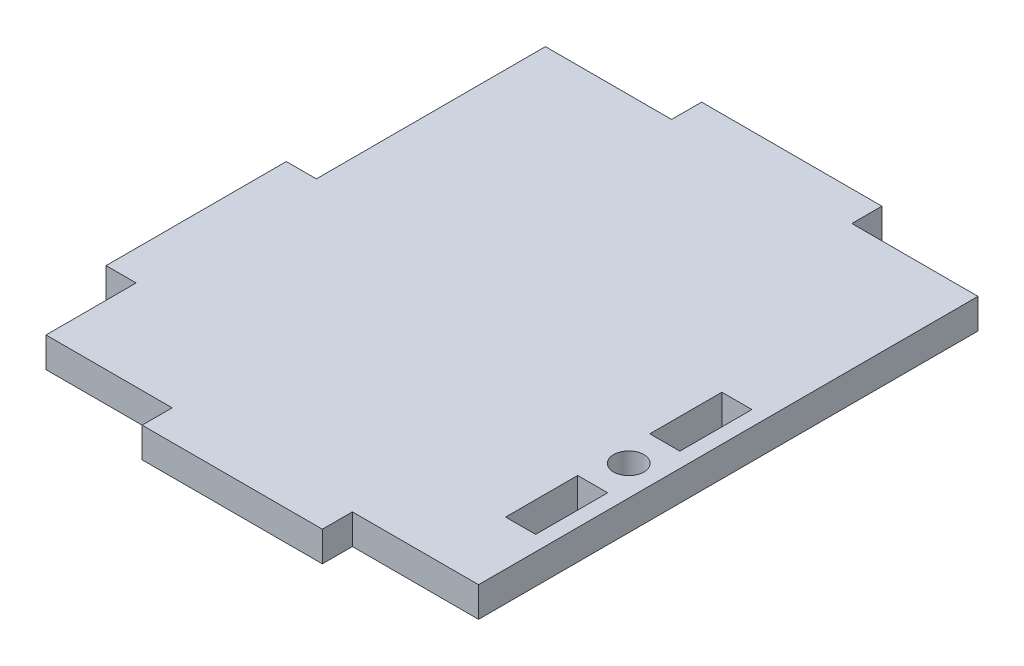
ISO-10303-21;
HEADER;
FILE_DESCRIPTION(('STEP AP214'),'2;1');
FILE_NAME('part.step','',(''),(''),'','','');
FILE_SCHEMA(('AUTOMOTIVE_DESIGN { 1 0 10303 214 1 1 1 1 }'));
ENDSEC;
DATA;
#1=APPLICATION_CONTEXT('core data for automotive mechanical design processes');
#2=APPLICATION_PROTOCOL_DEFINITION('international standard','automotive_design',2000,#1);
#3=PRODUCT_CONTEXT('',#1,'mechanical');
#4=PRODUCT('Part','Part','',(#3));
#5=PRODUCT_RELATED_PRODUCT_CATEGORY('part','',(#4));
#6=PRODUCT_DEFINITION_FORMATION('','',#4);
#7=PRODUCT_DEFINITION_CONTEXT('part definition',#1,'design');
#8=PRODUCT_DEFINITION('design','',#6,#7);
#9=PRODUCT_DEFINITION_SHAPE('','',#8);
#10=(LENGTH_UNIT() NAMED_UNIT(*) SI_UNIT(.MILLI.,.METRE.));
#11=(NAMED_UNIT(*) PLANE_ANGLE_UNIT() SI_UNIT($,.RADIAN.));
#12=(NAMED_UNIT(*) SI_UNIT($,.STERADIAN.) SOLID_ANGLE_UNIT());
#13=UNCERTAINTY_MEASURE_WITH_UNIT(LENGTH_MEASURE(1.E-05),#10,'distance_accuracy_value','');
#14=(GEOMETRIC_REPRESENTATION_CONTEXT(3) GLOBAL_UNCERTAINTY_ASSIGNED_CONTEXT((#13)) GLOBAL_UNIT_ASSIGNED_CONTEXT((#10,
#11,#12)) REPRESENTATION_CONTEXT('',''));
#15=CARTESIAN_POINT('',(0.,0.,0.));
#16=DIRECTION('',(0.,0.,1.));
#17=DIRECTION('',(1.,0.,0.));
#18=AXIS2_PLACEMENT_3D('',#15,#16,#17);
#19=CARTESIAN_POINT('',(0.,3.175,0.));
#20=DIRECTION('',(0.,1.,0.));
#21=DIRECTION('',(0.,0.,1.));
#22=AXIS2_PLACEMENT_3D('',#19,#20,#21);
#23=PLANE('',#22);
#24=CARTESIAN_POINT('',(42.545,3.175,-19.05));
#25=DIRECTION('',(0.,1.,0.));
#26=DIRECTION('',(0.,0.,1.));
#27=AXIS2_PLACEMENT_3D('',#24,#25,#26);
#28=CIRCLE('',#27,1.6);
#29=CARTESIAN_POINT('',(42.545,3.175,-17.45));
#30=VERTEX_POINT('',#29);
#31=EDGE_CURVE('E686',#30,#30,#28,.T.);
#32=ORIENTED_EDGE('',*,*,#31,.F.);
#33=EDGE_LOOP('',(#32));
#34=FACE_BOUND('',#33,.T.);
#35=DIRECTION('',(0.,0.,1.));
#36=VECTOR('',#35,1.);
#37=CARTESIAN_POINT('',(0.,3.175,-9.525));
#38=LINE('',#37,#36);
#39=CARTESIAN_POINT('',(0.,3.175,-9.525));
#40=VERTEX_POINT('',#39);
#41=CARTESIAN_POINT('',(0.,3.175,0.));
#42=VERTEX_POINT('',#41);
#43=EDGE_CURVE('E263',#40,#42,#38,.T.);
#44=ORIENTED_EDGE('',*,*,#43,.T.);
#45=DIRECTION('',(1.,0.,0.));
#46=VECTOR('',#45,1.);
#47=CARTESIAN_POINT('',(0.,3.175,0.));
#48=LINE('',#47,#46);
#49=CARTESIAN_POINT('',(13.335,3.175,0.));
#50=VERTEX_POINT('',#49);
#51=EDGE_CURVE('E266',#42,#50,#48,.T.);
#52=ORIENTED_EDGE('',*,*,#51,.T.);
#53=DIRECTION('',(0.,0.,1.));
#54=VECTOR('',#53,1.);
#55=CARTESIAN_POINT('',(13.335,3.175,0.));
#56=LINE('',#55,#54);
#57=CARTESIAN_POINT('',(13.335,3.175,3.175));
#58=VERTEX_POINT('',#57);
#59=EDGE_CURVE('E269',#50,#58,#56,.T.);
#60=ORIENTED_EDGE('',*,*,#59,.T.);
#61=DIRECTION('',(1.,0.,0.));
#62=VECTOR('',#61,1.);
#63=CARTESIAN_POINT('',(13.335,3.175,3.175));
#64=LINE('',#63,#62);
#65=CARTESIAN_POINT('',(32.385,3.175,3.175));
#66=VERTEX_POINT('',#65);
#67=EDGE_CURVE('E271',#58,#66,#64,.T.);
#68=ORIENTED_EDGE('',*,*,#67,.T.);
#69=DIRECTION('',(0.,0.,-1.));
#70=VECTOR('',#69,1.);
#71=CARTESIAN_POINT('',(32.385,3.175,3.175));
#72=LINE('',#71,#70);
#73=CARTESIAN_POINT('',(32.385,3.175,0.));
#74=VERTEX_POINT('',#73);
#75=EDGE_CURVE('E273',#66,#74,#72,.T.);
#76=ORIENTED_EDGE('',*,*,#75,.T.);
#77=DIRECTION('',(1.,0.,0.));
#78=VECTOR('',#77,1.);
#79=CARTESIAN_POINT('',(32.385,3.175,0.));
#80=LINE('',#79,#78);
#81=CARTESIAN_POINT('',(45.72,3.175,0.));
#82=VERTEX_POINT('',#81);
#83=EDGE_CURVE('E275',#74,#82,#80,.T.);
#84=ORIENTED_EDGE('',*,*,#83,.T.);
#85=DIRECTION('',(0.,0.,-1.));
#86=VECTOR('',#85,1.);
#87=CARTESIAN_POINT('',(45.72,3.175,0.));
#88=LINE('',#87,#86);
#89=CARTESIAN_POINT('',(45.72,3.175,-52.78882));
#90=VERTEX_POINT('',#89);
#91=EDGE_CURVE('E277',#82,#90,#88,.T.);
#92=ORIENTED_EDGE('',*,*,#91,.T.);
#93=DIRECTION('',(-1.,0.,0.));
#94=VECTOR('',#93,1.);
#95=CARTESIAN_POINT('',(45.72,3.175,-52.78882));
#96=LINE('',#95,#94);
#97=CARTESIAN_POINT('',(32.385,3.175,-52.78882));
#98=VERTEX_POINT('',#97);
#99=EDGE_CURVE('E279',#90,#98,#96,.T.);
#100=ORIENTED_EDGE('',*,*,#99,.T.);
#101=DIRECTION('',(0.,0.,-1.));
#102=VECTOR('',#101,1.);
#103=CARTESIAN_POINT('',(32.385,3.175,-52.78882));
#104=LINE('',#103,#102);
#105=CARTESIAN_POINT('',(32.385,3.175,-55.96382));
#106=VERTEX_POINT('',#105);
#107=EDGE_CURVE('E281',#98,#106,#104,.T.);
#108=ORIENTED_EDGE('',*,*,#107,.T.);
#109=DIRECTION('',(-1.,0.,0.));
#110=VECTOR('',#109,1.);
#111=CARTESIAN_POINT('',(32.385,3.175,-55.96382));
#112=LINE('',#111,#110);
#113=CARTESIAN_POINT('',(13.335,3.175,-55.96382));
#114=VERTEX_POINT('',#113);
#115=EDGE_CURVE('E283',#106,#114,#112,.T.);
#116=ORIENTED_EDGE('',*,*,#115,.T.);
#117=DIRECTION('',(0.,0.,1.));
#118=VECTOR('',#117,1.);
#119=CARTESIAN_POINT('',(13.335,3.175,-55.96382));
#120=LINE('',#119,#118);
#121=CARTESIAN_POINT('',(13.335,3.175,-52.78882));
#122=VERTEX_POINT('',#121);
#123=EDGE_CURVE('E285',#114,#122,#120,.T.);
#124=ORIENTED_EDGE('',*,*,#123,.T.);
#125=DIRECTION('',(-1.,0.,0.));
#126=VECTOR('',#125,1.);
#127=CARTESIAN_POINT('',(13.335,3.175,-52.78882));
#128=LINE('',#127,#126);
#129=CARTESIAN_POINT('',(0.,3.175,-52.78882));
#130=VERTEX_POINT('',#129);
#131=EDGE_CURVE('E287',#122,#130,#128,.T.);
#132=ORIENTED_EDGE('',*,*,#131,.T.);
#133=DIRECTION('',(0.,0.,1.));
#134=VECTOR('',#133,1.);
#135=CARTESIAN_POINT('',(0.,3.175,-52.78882));
#136=LINE('',#135,#134);
#137=CARTESIAN_POINT('',(0.,3.175,-28.575));
#138=VERTEX_POINT('',#137);
#139=EDGE_CURVE('E289',#130,#138,#136,.T.);
#140=ORIENTED_EDGE('',*,*,#139,.T.);
#141=DIRECTION('',(-1.,0.,0.));
#142=VECTOR('',#141,1.);
#143=CARTESIAN_POINT('',(0.,3.175,-28.575));
#144=LINE('',#143,#142);
#145=CARTESIAN_POINT('',(-3.175,3.175,-28.575));
#146=VERTEX_POINT('',#145);
#147=EDGE_CURVE('E291',#138,#146,#144,.T.);
#148=ORIENTED_EDGE('',*,*,#147,.T.);
#149=DIRECTION('',(0.,0.,1.));
#150=VECTOR('',#149,1.);
#151=CARTESIAN_POINT('',(-3.175,3.175,-28.575));
#152=LINE('',#151,#150);
#153=CARTESIAN_POINT('',(-3.17499999999999,3.175,-9.525));
#154=VERTEX_POINT('',#153);
#155=EDGE_CURVE('E293',#146,#154,#152,.T.);
#156=ORIENTED_EDGE('',*,*,#155,.T.);
#157=DIRECTION('',(1.,0.,0.));
#158=VECTOR('',#157,1.);
#159=CARTESIAN_POINT('',(-3.17499999999999,3.175,-9.525));
#160=LINE('',#159,#158);
#161=EDGE_CURVE('E295',#154,#40,#160,.T.);
#162=ORIENTED_EDGE('',*,*,#161,.T.);
#163=EDGE_LOOP('',(#44,#52,#60,#68,#76,#84,#92,#100,#108,#116,#124,#132,#140,#148,#156,#162));
#164=FACE_BOUND('',#163,.T.);
#165=DIRECTION('',(1.,0.,0.));
#166=VECTOR('',#165,1.);
#167=CARTESIAN_POINT('',(40.9575,3.175,-22.86));
#168=LINE('',#167,#166);
#169=CARTESIAN_POINT('',(40.9575,3.175,-22.86));
#170=VERTEX_POINT('',#169);
#171=CARTESIAN_POINT('',(44.1325,3.175,-22.86));
#172=VERTEX_POINT('',#171);
#173=EDGE_CURVE('E234',#170,#172,#168,.T.);
#174=ORIENTED_EDGE('',*,*,#173,.F.);
#175=DIRECTION('',(0.,0.,1.));
#176=VECTOR('',#175,1.);
#177=CARTESIAN_POINT('',(40.9575,3.175,-30.48));
#178=LINE('',#177,#176);
#179=CARTESIAN_POINT('',(40.9575,3.175,-30.48));
#180=VERTEX_POINT('',#179);
#181=EDGE_CURVE('E232',#180,#170,#178,.T.);
#182=ORIENTED_EDGE('',*,*,#181,.F.);
#183=DIRECTION('',(-1.,0.,0.));
#184=VECTOR('',#183,1.);
#185=CARTESIAN_POINT('',(40.9575,3.175,-30.48));
#186=LINE('',#185,#184);
#187=CARTESIAN_POINT('',(44.1325,3.175,-30.48));
#188=VERTEX_POINT('',#187);
#189=EDGE_CURVE('E240',#188,#180,#186,.T.);
#190=ORIENTED_EDGE('',*,*,#189,.F.);
#191=DIRECTION('',(0.,0.,-1.));
#192=VECTOR('',#191,1.);
#193=CARTESIAN_POINT('',(44.1325,3.175,-30.48));
#194=LINE('',#193,#192);
#195=EDGE_CURVE('E237',#172,#188,#194,.T.);
#196=ORIENTED_EDGE('',*,*,#195,.F.);
#197=EDGE_LOOP('',(#174,#182,#190,#196));
#198=FACE_BOUND('',#197,.T.);
#199=DIRECTION('',(1.,0.,0.));
#200=VECTOR('',#199,1.);
#201=CARTESIAN_POINT('',(40.9575,3.175,-7.62));
#202=LINE('',#201,#200);
#203=CARTESIAN_POINT('',(40.9575,3.175,-7.62));
#204=VERTEX_POINT('',#203);
#205=CARTESIAN_POINT('',(44.1325,3.175,-7.62));
#206=VERTEX_POINT('',#205);
#207=EDGE_CURVE('E202',#204,#206,#202,.T.);
#208=ORIENTED_EDGE('',*,*,#207,.F.);
#209=DIRECTION('',(0.,0.,1.));
#210=VECTOR('',#209,1.);
#211=CARTESIAN_POINT('',(40.9575,3.175,-15.24));
#212=LINE('',#211,#210);
#213=CARTESIAN_POINT('',(40.9575,3.175,-15.24));
#214=VERTEX_POINT('',#213);
#215=EDGE_CURVE('E194',#214,#204,#212,.T.);
#216=ORIENTED_EDGE('',*,*,#215,.F.);
#217=DIRECTION('',(-1.,0.,0.));
#218=VECTOR('',#217,1.);
#219=CARTESIAN_POINT('',(40.9575,3.175,-15.24));
#220=LINE('',#219,#218);
#221=CARTESIAN_POINT('',(44.1325,3.175,-15.24));
#222=VERTEX_POINT('',#221);
#223=EDGE_CURVE('E216',#222,#214,#220,.T.);
#224=ORIENTED_EDGE('',*,*,#223,.F.);
#225=DIRECTION('',(0.,0.,-1.));
#226=VECTOR('',#225,1.);
#227=CARTESIAN_POINT('',(44.1325,3.175,-15.24));
#228=LINE('',#227,#226);
#229=EDGE_CURVE('E214',#206,#222,#228,.T.);
#230=ORIENTED_EDGE('',*,*,#229,.F.);
#231=EDGE_LOOP('',(#208,#216,#224,#230));
#232=FACE_BOUND('',#231,.T.);
#233=ADVANCED_FACE('F33',(#34,#164,#198,#232),#23,.T.);
#234=CARTESIAN_POINT('',(0.,0.,0.));
#235=DIRECTION('',(0.,1.,0.));
#236=DIRECTION('',(0.,0.,1.));
#237=AXIS2_PLACEMENT_3D('',#234,#235,#236);
#238=PLANE('',#237);
#239=CARTESIAN_POINT('',(42.545,0.,-19.05));
#240=DIRECTION('',(0.,1.,0.));
#241=DIRECTION('',(0.,0.,1.));
#242=AXIS2_PLACEMENT_3D('',#239,#240,#241);
#243=CIRCLE('',#242,1.6);
#244=CARTESIAN_POINT('',(42.545,0.,-17.45));
#245=VERTEX_POINT('',#244);
#246=EDGE_CURVE('E222',#245,#245,#243,.T.);
#247=ORIENTED_EDGE('',*,*,#246,.T.);
#248=EDGE_LOOP('',(#247));
#249=FACE_BOUND('',#248,.T.);
#250=DIRECTION('',(0.,0.,1.));
#251=VECTOR('',#250,1.);
#252=CARTESIAN_POINT('',(40.9575,0.,-30.48));
#253=LINE('',#252,#251);
#254=CARTESIAN_POINT('',(40.9575,0.,-30.48));
#255=VERTEX_POINT('',#254);
#256=CARTESIAN_POINT('',(40.9575,0.,-22.86));
#257=VERTEX_POINT('',#256);
#258=EDGE_CURVE('E210',#255,#257,#253,.T.);
#259=ORIENTED_EDGE('',*,*,#258,.T.);
#260=DIRECTION('',(1.,0.,0.));
#261=VECTOR('',#260,1.);
#262=CARTESIAN_POINT('',(40.9575,0.,-22.86));
#263=LINE('',#262,#261);
#264=CARTESIAN_POINT('',(44.1325,0.,-22.86));
#265=VERTEX_POINT('',#264);
#266=EDGE_CURVE('E245',#257,#265,#263,.T.);
#267=ORIENTED_EDGE('',*,*,#266,.T.);
#268=DIRECTION('',(0.,0.,-1.));
#269=VECTOR('',#268,1.);
#270=CARTESIAN_POINT('',(44.1325,0.,-30.48));
#271=LINE('',#270,#269);
#272=CARTESIAN_POINT('',(44.1325,0.,-30.48));
#273=VERTEX_POINT('',#272);
#274=EDGE_CURVE('E248',#265,#273,#271,.T.);
#275=ORIENTED_EDGE('',*,*,#274,.T.);
#276=DIRECTION('',(-1.,0.,0.));
#277=VECTOR('',#276,1.);
#278=CARTESIAN_POINT('',(40.9575,0.,-30.48));
#279=LINE('',#278,#277);
#280=EDGE_CURVE('E235',#273,#255,#279,.T.);
#281=ORIENTED_EDGE('',*,*,#280,.T.);
#282=EDGE_LOOP('',(#259,#267,#275,#281));
#283=FACE_BOUND('',#282,.T.);
#284=DIRECTION('',(0.,0.,1.));
#285=VECTOR('',#284,1.);
#286=CARTESIAN_POINT('',(0.,0.,-9.525));
#287=LINE('',#286,#285);
#288=CARTESIAN_POINT('',(0.,0.,-9.525));
#289=VERTEX_POINT('',#288);
#290=CARTESIAN_POINT('',(0.,0.,0.));
#291=VERTEX_POINT('',#290);
#292=EDGE_CURVE('E262',#289,#291,#287,.T.);
#293=ORIENTED_EDGE('',*,*,#292,.F.);
#294=DIRECTION('',(1.,0.,0.));
#295=VECTOR('',#294,1.);
#296=CARTESIAN_POINT('',(-3.17499999999999,0.,-9.525));
#297=LINE('',#296,#295);
#298=CARTESIAN_POINT('',(-3.17499999999999,0.,-9.525));
#299=VERTEX_POINT('',#298);
#300=EDGE_CURVE('E267',#299,#289,#297,.T.);
#301=ORIENTED_EDGE('',*,*,#300,.F.);
#302=DIRECTION('',(0.,0.,1.));
#303=VECTOR('',#302,1.);
#304=CARTESIAN_POINT('',(-3.175,0.,-28.575));
#305=LINE('',#304,#303);
#306=CARTESIAN_POINT('',(-3.175,0.,-28.575));
#307=VERTEX_POINT('',#306);
#308=EDGE_CURVE('E326',#307,#299,#305,.T.);
#309=ORIENTED_EDGE('',*,*,#308,.F.);
#310=DIRECTION('',(-1.,0.,0.));
#311=VECTOR('',#310,1.);
#312=CARTESIAN_POINT('',(0.,0.,-28.575));
#313=LINE('',#312,#311);
#314=CARTESIAN_POINT('',(0.,0.,-28.575));
#315=VERTEX_POINT('',#314);
#316=EDGE_CURVE('E324',#315,#307,#313,.T.);
#317=ORIENTED_EDGE('',*,*,#316,.F.);
#318=DIRECTION('',(0.,0.,1.));
#319=VECTOR('',#318,1.);
#320=CARTESIAN_POINT('',(0.,0.,-52.78882));
#321=LINE('',#320,#319);
#322=CARTESIAN_POINT('',(0.,0.,-52.78882));
#323=VERTEX_POINT('',#322);
#324=EDGE_CURVE('E322',#323,#315,#321,.T.);
#325=ORIENTED_EDGE('',*,*,#324,.F.);
#326=DIRECTION('',(-1.,0.,0.));
#327=VECTOR('',#326,1.);
#328=CARTESIAN_POINT('',(13.335,0.,-52.78882));
#329=LINE('',#328,#327);
#330=CARTESIAN_POINT('',(13.335,0.,-52.78882));
#331=VERTEX_POINT('',#330);
#332=EDGE_CURVE('E320',#331,#323,#329,.T.);
#333=ORIENTED_EDGE('',*,*,#332,.F.);
#334=DIRECTION('',(0.,0.,1.));
#335=VECTOR('',#334,1.);
#336=CARTESIAN_POINT('',(13.335,0.,-55.96382));
#337=LINE('',#336,#335);
#338=CARTESIAN_POINT('',(13.335,0.,-55.96382));
#339=VERTEX_POINT('',#338);
#340=EDGE_CURVE('E318',#339,#331,#337,.T.);
#341=ORIENTED_EDGE('',*,*,#340,.F.);
#342=DIRECTION('',(-1.,0.,0.));
#343=VECTOR('',#342,1.);
#344=CARTESIAN_POINT('',(32.385,0.,-55.96382));
#345=LINE('',#344,#343);
#346=CARTESIAN_POINT('',(32.385,0.,-55.96382));
#347=VERTEX_POINT('',#346);
#348=EDGE_CURVE('E316',#347,#339,#345,.T.);
#349=ORIENTED_EDGE('',*,*,#348,.F.);
#350=DIRECTION('',(0.,0.,-1.));
#351=VECTOR('',#350,1.);
#352=CARTESIAN_POINT('',(32.385,0.,-52.78882));
#353=LINE('',#352,#351);
#354=CARTESIAN_POINT('',(32.385,0.,-52.78882));
#355=VERTEX_POINT('',#354);
#356=EDGE_CURVE('E314',#355,#347,#353,.T.);
#357=ORIENTED_EDGE('',*,*,#356,.F.);
#358=DIRECTION('',(-1.,0.,0.));
#359=VECTOR('',#358,1.);
#360=CARTESIAN_POINT('',(45.72,0.,-52.78882));
#361=LINE('',#360,#359);
#362=CARTESIAN_POINT('',(45.72,0.,-52.78882));
#363=VERTEX_POINT('',#362);
#364=EDGE_CURVE('E312',#363,#355,#361,.T.);
#365=ORIENTED_EDGE('',*,*,#364,.F.);
#366=DIRECTION('',(0.,0.,-1.));
#367=VECTOR('',#366,1.);
#368=CARTESIAN_POINT('',(45.72,0.,0.));
#369=LINE('',#368,#367);
#370=CARTESIAN_POINT('',(45.72,0.,0.));
#371=VERTEX_POINT('',#370);
#372=EDGE_CURVE('E310',#371,#363,#369,.T.);
#373=ORIENTED_EDGE('',*,*,#372,.F.);
#374=DIRECTION('',(1.,0.,0.));
#375=VECTOR('',#374,1.);
#376=CARTESIAN_POINT('',(32.385,0.,0.));
#377=LINE('',#376,#375);
#378=CARTESIAN_POINT('',(32.385,0.,0.));
#379=VERTEX_POINT('',#378);
#380=EDGE_CURVE('E308',#379,#371,#377,.T.);
#381=ORIENTED_EDGE('',*,*,#380,.F.);
#382=DIRECTION('',(0.,0.,-1.));
#383=VECTOR('',#382,1.);
#384=CARTESIAN_POINT('',(32.385,0.,3.175));
#385=LINE('',#384,#383);
#386=CARTESIAN_POINT('',(32.385,0.,3.175));
#387=VERTEX_POINT('',#386);
#388=EDGE_CURVE('E306',#387,#379,#385,.T.);
#389=ORIENTED_EDGE('',*,*,#388,.F.);
#390=DIRECTION('',(1.,0.,0.));
#391=VECTOR('',#390,1.);
#392=CARTESIAN_POINT('',(13.335,0.,3.175));
#393=LINE('',#392,#391);
#394=CARTESIAN_POINT('',(13.335,0.,3.175));
#395=VERTEX_POINT('',#394);
#396=EDGE_CURVE('E304',#395,#387,#393,.T.);
#397=ORIENTED_EDGE('',*,*,#396,.F.);
#398=DIRECTION('',(0.,0.,1.));
#399=VECTOR('',#398,1.);
#400=CARTESIAN_POINT('',(13.335,0.,0.));
#401=LINE('',#400,#399);
#402=CARTESIAN_POINT('',(13.335,0.,0.));
#403=VERTEX_POINT('',#402);
#404=EDGE_CURVE('E302',#403,#395,#401,.T.);
#405=ORIENTED_EDGE('',*,*,#404,.F.);
#406=DIRECTION('',(1.,0.,0.));
#407=VECTOR('',#406,1.);
#408=CARTESIAN_POINT('',(0.,0.,0.));
#409=LINE('',#408,#407);
#410=EDGE_CURVE('E300',#291,#403,#409,.T.);
#411=ORIENTED_EDGE('',*,*,#410,.F.);
#412=EDGE_LOOP('',(#293,#301,#309,#317,#325,#333,#341,#349,#357,#365,#373,#381,#389,#397,#405,#411));
#413=FACE_BOUND('',#412,.T.);
#414=DIRECTION('',(0.,0.,1.));
#415=VECTOR('',#414,1.);
#416=CARTESIAN_POINT('',(40.9575,0.,-15.24));
#417=LINE('',#416,#415);
#418=CARTESIAN_POINT('',(40.9575,0.,-15.24));
#419=VERTEX_POINT('',#418);
#420=CARTESIAN_POINT('',(40.9575,0.,-7.62));
#421=VERTEX_POINT('',#420);
#422=EDGE_CURVE('E56',#419,#421,#417,.T.);
#423=ORIENTED_EDGE('',*,*,#422,.T.);
#424=DIRECTION('',(1.,0.,0.));
#425=VECTOR('',#424,1.);
#426=CARTESIAN_POINT('',(40.9575,0.,-7.62));
#427=LINE('',#426,#425);
#428=CARTESIAN_POINT('',(44.1325,0.,-7.62));
#429=VERTEX_POINT('',#428);
#430=EDGE_CURVE('E209',#421,#429,#427,.T.);
#431=ORIENTED_EDGE('',*,*,#430,.T.);
#432=DIRECTION('',(0.,0.,-1.));
#433=VECTOR('',#432,1.);
#434=CARTESIAN_POINT('',(44.1325,0.,-15.24));
#435=LINE('',#434,#433);
#436=CARTESIAN_POINT('',(44.1325,0.,-15.24));
#437=VERTEX_POINT('',#436);
#438=EDGE_CURVE('E224',#429,#437,#435,.T.);
#439=ORIENTED_EDGE('',*,*,#438,.T.);
#440=DIRECTION('',(-1.,0.,0.));
#441=VECTOR('',#440,1.);
#442=CARTESIAN_POINT('',(40.9575,0.,-15.24));
#443=LINE('',#442,#441);
#444=EDGE_CURVE('E203',#437,#419,#443,.T.);
#445=ORIENTED_EDGE('',*,*,#444,.T.);
#446=EDGE_LOOP('',(#423,#431,#439,#445));
#447=FACE_BOUND('',#446,.T.);
#448=ADVANCED_FACE('F380',(#249,#283,#413,#447),#238,.F.);
#449=CARTESIAN_POINT('',(0.,3.175,-9.525));
#450=DIRECTION('',(1.,0.,0.));
#451=DIRECTION('',(0.,0.,-1.));
#452=AXIS2_PLACEMENT_3D('',#449,#450,#451);
#453=PLANE('',#452);
#454=ORIENTED_EDGE('',*,*,#292,.T.);
#455=DIRECTION('',(0.,-1.,0.));
#456=VECTOR('',#455,1.);
#457=CARTESIAN_POINT('',(0.,3.175,0.));
#458=LINE('',#457,#456);
#459=EDGE_CURVE('E11',#42,#291,#458,.T.);
#460=ORIENTED_EDGE('',*,*,#459,.F.);
#461=ORIENTED_EDGE('',*,*,#43,.F.);
#462=DIRECTION('',(0.,-1.,0.));
#463=VECTOR('',#462,1.);
#464=CARTESIAN_POINT('',(0.,3.175,-9.525));
#465=LINE('',#464,#463);
#466=EDGE_CURVE('E297',#40,#289,#465,.T.);
#467=ORIENTED_EDGE('',*,*,#466,.T.);
#468=EDGE_LOOP('',(#454,#460,#461,#467));
#469=FACE_BOUND('',#468,.T.);
#470=ADVANCED_FACE('F35',(#469),#453,.F.);
#471=CARTESIAN_POINT('',(0.,3.175,0.));
#472=DIRECTION('',(0.,0.,-1.));
#473=DIRECTION('',(-1.,0.,0.));
#474=AXIS2_PLACEMENT_3D('',#471,#472,#473);
#475=PLANE('',#474);
#476=ORIENTED_EDGE('',*,*,#410,.T.);
#477=DIRECTION('',(0.,-1.,0.));
#478=VECTOR('',#477,1.);
#479=CARTESIAN_POINT('',(13.335,3.175,0.));
#480=LINE('',#479,#478);
#481=EDGE_CURVE('E41',#50,#403,#480,.T.);
#482=ORIENTED_EDGE('',*,*,#481,.F.);
#483=ORIENTED_EDGE('',*,*,#51,.F.);
#484=ORIENTED_EDGE('',*,*,#459,.T.);
#485=EDGE_LOOP('',(#476,#482,#483,#484));
#486=FACE_BOUND('',#485,.T.);
#487=ADVANCED_FACE('F398',(#486),#475,.F.);
#488=CARTESIAN_POINT('',(13.335,3.175,0.));
#489=DIRECTION('',(1.,0.,0.));
#490=DIRECTION('',(0.,0.,-1.));
#491=AXIS2_PLACEMENT_3D('',#488,#489,#490);
#492=PLANE('',#491);
#493=ORIENTED_EDGE('',*,*,#404,.T.);
#494=DIRECTION('',(0.,-1.,0.));
#495=VECTOR('',#494,1.);
#496=CARTESIAN_POINT('',(13.335,3.175,3.175));
#497=LINE('',#496,#495);
#498=EDGE_CURVE('E367',#58,#395,#497,.T.);
#499=ORIENTED_EDGE('',*,*,#498,.F.);
#500=ORIENTED_EDGE('',*,*,#59,.F.);
#501=ORIENTED_EDGE('',*,*,#481,.T.);
#502=EDGE_LOOP('',(#493,#499,#500,#501));
#503=FACE_BOUND('',#502,.T.);
#504=ADVANCED_FACE('F374',(#503),#492,.F.);
#505=CARTESIAN_POINT('',(13.335,3.175,3.175));
#506=DIRECTION('',(0.,0.,-1.));
#507=DIRECTION('',(-1.,0.,0.));
#508=AXIS2_PLACEMENT_3D('',#505,#506,#507);
#509=PLANE('',#508);
#510=ORIENTED_EDGE('',*,*,#396,.T.);
#511=DIRECTION('',(0.,-1.,0.));
#512=VECTOR('',#511,1.);
#513=CARTESIAN_POINT('',(32.385,3.175,3.175));
#514=LINE('',#513,#512);
#515=EDGE_CURVE('E364',#66,#387,#514,.T.);
#516=ORIENTED_EDGE('',*,*,#515,.F.);
#517=ORIENTED_EDGE('',*,*,#67,.F.);
#518=ORIENTED_EDGE('',*,*,#498,.T.);
#519=EDGE_LOOP('',(#510,#516,#517,#518));
#520=FACE_BOUND('',#519,.T.);
#521=ADVANCED_FACE('F386',(#520),#509,.F.);
#522=CARTESIAN_POINT('',(32.385,3.175,3.175));
#523=DIRECTION('',(-1.,0.,0.));
#524=DIRECTION('',(0.,0.,1.));
#525=AXIS2_PLACEMENT_3D('',#522,#523,#524);
#526=PLANE('',#525);
#527=ORIENTED_EDGE('',*,*,#388,.T.);
#528=DIRECTION('',(0.,-1.,0.));
#529=VECTOR('',#528,1.);
#530=CARTESIAN_POINT('',(32.385,3.175,0.));
#531=LINE('',#530,#529);
#532=EDGE_CURVE('E361',#74,#379,#531,.T.);
#533=ORIENTED_EDGE('',*,*,#532,.F.);
#534=ORIENTED_EDGE('',*,*,#75,.F.);
#535=ORIENTED_EDGE('',*,*,#515,.T.);
#536=EDGE_LOOP('',(#527,#533,#534,#535));
#537=FACE_BOUND('',#536,.T.);
#538=ADVANCED_FACE('F390',(#537),#526,.F.);
#539=CARTESIAN_POINT('',(32.385,3.175,0.));
#540=DIRECTION('',(0.,0.,-1.));
#541=DIRECTION('',(-1.,0.,0.));
#542=AXIS2_PLACEMENT_3D('',#539,#540,#541);
#543=PLANE('',#542);
#544=ORIENTED_EDGE('',*,*,#380,.T.);
#545=DIRECTION('',(0.,-1.,0.));
#546=VECTOR('',#545,1.);
#547=CARTESIAN_POINT('',(45.72,3.175,0.));
#548=LINE('',#547,#546);
#549=EDGE_CURVE('E358',#82,#371,#548,.T.);
#550=ORIENTED_EDGE('',*,*,#549,.F.);
#551=ORIENTED_EDGE('',*,*,#83,.F.);
#552=ORIENTED_EDGE('',*,*,#532,.T.);
#553=EDGE_LOOP('',(#544,#550,#551,#552));
#554=FACE_BOUND('',#553,.T.);
#555=ADVANCED_FACE('F451',(#554),#543,.F.);
#556=CARTESIAN_POINT('',(45.72,3.175,0.));
#557=DIRECTION('',(-1.,0.,0.));
#558=DIRECTION('',(0.,0.,1.));
#559=AXIS2_PLACEMENT_3D('',#556,#557,#558);
#560=PLANE('',#559);
#561=ORIENTED_EDGE('',*,*,#372,.T.);
#562=DIRECTION('',(0.,-1.,0.));
#563=VECTOR('',#562,1.);
#564=CARTESIAN_POINT('',(45.72,3.175,-52.78882));
#565=LINE('',#564,#563);
#566=EDGE_CURVE('E355',#90,#363,#565,.T.);
#567=ORIENTED_EDGE('',*,*,#566,.F.);
#568=ORIENTED_EDGE('',*,*,#91,.F.);
#569=ORIENTED_EDGE('',*,*,#549,.T.);
#570=EDGE_LOOP('',(#561,#567,#568,#569));
#571=FACE_BOUND('',#570,.T.);
#572=ADVANCED_FACE('F448',(#571),#560,.F.);
#573=CARTESIAN_POINT('',(45.72,3.175,-52.78882));
#574=DIRECTION('',(0.,0.,1.));
#575=DIRECTION('',(1.,0.,0.));
#576=AXIS2_PLACEMENT_3D('',#573,#574,#575);
#577=PLANE('',#576);
#578=ORIENTED_EDGE('',*,*,#364,.T.);
#579=DIRECTION('',(0.,-1.,0.));
#580=VECTOR('',#579,1.);
#581=CARTESIAN_POINT('',(32.385,3.175,-52.78882));
#582=LINE('',#581,#580);
#583=EDGE_CURVE('E352',#98,#355,#582,.T.);
#584=ORIENTED_EDGE('',*,*,#583,.F.);
#585=ORIENTED_EDGE('',*,*,#99,.F.);
#586=ORIENTED_EDGE('',*,*,#566,.T.);
#587=EDGE_LOOP('',(#578,#584,#585,#586));
#588=FACE_BOUND('',#587,.T.);
#589=ADVANCED_FACE('F444',(#588),#577,.F.);
#590=CARTESIAN_POINT('',(32.385,3.175,-52.78882));
#591=DIRECTION('',(-1.,0.,0.));
#592=DIRECTION('',(0.,0.,1.));
#593=AXIS2_PLACEMENT_3D('',#590,#591,#592);
#594=PLANE('',#593);
#595=ORIENTED_EDGE('',*,*,#356,.T.);
#596=DIRECTION('',(0.,-1.,0.));
#597=VECTOR('',#596,1.);
#598=CARTESIAN_POINT('',(32.385,3.175,-55.96382));
#599=LINE('',#598,#597);
#600=EDGE_CURVE('E349',#106,#347,#599,.T.);
#601=ORIENTED_EDGE('',*,*,#600,.F.);
#602=ORIENTED_EDGE('',*,*,#107,.F.);
#603=ORIENTED_EDGE('',*,*,#583,.T.);
#604=EDGE_LOOP('',(#595,#601,#602,#603));
#605=FACE_BOUND('',#604,.T.);
#606=ADVANCED_FACE('F440',(#605),#594,.F.);
#607=CARTESIAN_POINT('',(32.385,3.175,-55.96382));
#608=DIRECTION('',(0.,0.,1.));
#609=DIRECTION('',(1.,0.,0.));
#610=AXIS2_PLACEMENT_3D('',#607,#608,#609);
#611=PLANE('',#610);
#612=ORIENTED_EDGE('',*,*,#348,.T.);
#613=DIRECTION('',(0.,-1.,0.));
#614=VECTOR('',#613,1.);
#615=CARTESIAN_POINT('',(13.335,3.175,-55.96382));
#616=LINE('',#615,#614);
#617=EDGE_CURVE('E346',#114,#339,#616,.T.);
#618=ORIENTED_EDGE('',*,*,#617,.F.);
#619=ORIENTED_EDGE('',*,*,#115,.F.);
#620=ORIENTED_EDGE('',*,*,#600,.T.);
#621=EDGE_LOOP('',(#612,#618,#619,#620));
#622=FACE_BOUND('',#621,.T.);
#623=ADVANCED_FACE('F435',(#622),#611,.F.);
#624=CARTESIAN_POINT('',(13.335,3.175,-55.96382));
#625=DIRECTION('',(1.,0.,0.));
#626=DIRECTION('',(0.,0.,-1.));
#627=AXIS2_PLACEMENT_3D('',#624,#625,#626);
#628=PLANE('',#627);
#629=ORIENTED_EDGE('',*,*,#340,.T.);
#630=DIRECTION('',(0.,-1.,0.));
#631=VECTOR('',#630,1.);
#632=CARTESIAN_POINT('',(13.335,3.175,-52.78882));
#633=LINE('',#632,#631);
#634=EDGE_CURVE('E343',#122,#331,#633,.T.);
#635=ORIENTED_EDGE('',*,*,#634,.F.);
#636=ORIENTED_EDGE('',*,*,#123,.F.);
#637=ORIENTED_EDGE('',*,*,#617,.T.);
#638=EDGE_LOOP('',(#629,#635,#636,#637));
#639=FACE_BOUND('',#638,.T.);
#640=ADVANCED_FACE('F429',(#639),#628,.F.);
#641=CARTESIAN_POINT('',(13.335,3.175,-52.78882));
#642=DIRECTION('',(0.,0.,1.));
#643=DIRECTION('',(1.,0.,0.));
#644=AXIS2_PLACEMENT_3D('',#641,#642,#643);
#645=PLANE('',#644);
#646=ORIENTED_EDGE('',*,*,#332,.T.);
#647=DIRECTION('',(0.,-1.,0.));
#648=VECTOR('',#647,1.);
#649=CARTESIAN_POINT('',(0.,3.175,-52.78882));
#650=LINE('',#649,#648);
#651=EDGE_CURVE('E340',#130,#323,#650,.T.);
#652=ORIENTED_EDGE('',*,*,#651,.F.);
#653=ORIENTED_EDGE('',*,*,#131,.F.);
#654=ORIENTED_EDGE('',*,*,#634,.T.);
#655=EDGE_LOOP('',(#646,#652,#653,#654));
#656=FACE_BOUND('',#655,.T.);
#657=ADVANCED_FACE('F425',(#656),#645,.F.);
#658=CARTESIAN_POINT('',(0.,3.175,-52.78882));
#659=DIRECTION('',(1.,0.,0.));
#660=DIRECTION('',(0.,0.,-1.));
#661=AXIS2_PLACEMENT_3D('',#658,#659,#660);
#662=PLANE('',#661);
#663=ORIENTED_EDGE('',*,*,#324,.T.);
#664=DIRECTION('',(0.,-1.,0.));
#665=VECTOR('',#664,1.);
#666=CARTESIAN_POINT('',(0.,3.175,-28.575));
#667=LINE('',#666,#665);
#668=EDGE_CURVE('E337',#138,#315,#667,.T.);
#669=ORIENTED_EDGE('',*,*,#668,.F.);
#670=ORIENTED_EDGE('',*,*,#139,.F.);
#671=ORIENTED_EDGE('',*,*,#651,.T.);
#672=EDGE_LOOP('',(#663,#669,#670,#671));
#673=FACE_BOUND('',#672,.T.);
#674=ADVANCED_FACE('F420',(#673),#662,.F.);
#675=CARTESIAN_POINT('',(0.,3.175,-28.575));
#676=DIRECTION('',(0.,0.,1.));
#677=DIRECTION('',(1.,0.,0.));
#678=AXIS2_PLACEMENT_3D('',#675,#676,#677);
#679=PLANE('',#678);
#680=ORIENTED_EDGE('',*,*,#316,.T.);
#681=DIRECTION('',(0.,-1.,0.));
#682=VECTOR('',#681,1.);
#683=CARTESIAN_POINT('',(-3.175,3.175,-28.575));
#684=LINE('',#683,#682);
#685=EDGE_CURVE('E334',#146,#307,#684,.T.);
#686=ORIENTED_EDGE('',*,*,#685,.F.);
#687=ORIENTED_EDGE('',*,*,#147,.F.);
#688=ORIENTED_EDGE('',*,*,#668,.T.);
#689=EDGE_LOOP('',(#680,#686,#687,#688));
#690=FACE_BOUND('',#689,.T.);
#691=ADVANCED_FACE('F414',(#690),#679,.F.);
#692=CARTESIAN_POINT('',(-3.175,3.175,-28.575));
#693=DIRECTION('',(1.,0.,0.));
#694=DIRECTION('',(0.,0.,-1.));
#695=AXIS2_PLACEMENT_3D('',#692,#693,#694);
#696=PLANE('',#695);
#697=ORIENTED_EDGE('',*,*,#308,.T.);
#698=DIRECTION('',(0.,-1.,0.));
#699=VECTOR('',#698,1.);
#700=CARTESIAN_POINT('',(-3.17499999999999,3.175,-9.525));
#701=LINE('',#700,#699);
#702=EDGE_CURVE('E331',#154,#299,#701,.T.);
#703=ORIENTED_EDGE('',*,*,#702,.F.);
#704=ORIENTED_EDGE('',*,*,#155,.F.);
#705=ORIENTED_EDGE('',*,*,#685,.T.);
#706=EDGE_LOOP('',(#697,#703,#704,#705));
#707=FACE_BOUND('',#706,.T.);
#708=ADVANCED_FACE('F410',(#707),#696,.F.);
#709=CARTESIAN_POINT('',(-3.17499999999999,3.175,-9.525));
#710=DIRECTION('',(0.,0.,-1.));
#711=DIRECTION('',(-1.,0.,0.));
#712=AXIS2_PLACEMENT_3D('',#709,#710,#711);
#713=PLANE('',#712);
#714=ORIENTED_EDGE('',*,*,#300,.T.);
#715=ORIENTED_EDGE('',*,*,#466,.F.);
#716=ORIENTED_EDGE('',*,*,#161,.F.);
#717=ORIENTED_EDGE('',*,*,#702,.T.);
#718=EDGE_LOOP('',(#714,#715,#716,#717));
#719=FACE_BOUND('',#718,.T.);
#720=ADVANCED_FACE('F405',(#719),#713,.F.);
#721=CARTESIAN_POINT('',(40.9575,3.175,-30.48));
#722=DIRECTION('',(1.,0.,0.));
#723=DIRECTION('',(0.,0.,-1.));
#724=AXIS2_PLACEMENT_3D('',#721,#722,#723);
#725=PLANE('',#724);
#726=ORIENTED_EDGE('',*,*,#258,.F.);
#727=DIRECTION('',(0.,-1.,0.));
#728=VECTOR('',#727,1.);
#729=CARTESIAN_POINT('',(40.9575,3.175,-30.48));
#730=LINE('',#729,#728);
#731=EDGE_CURVE('E242',#180,#255,#730,.T.);
#732=ORIENTED_EDGE('',*,*,#731,.F.);
#733=ORIENTED_EDGE('',*,*,#181,.T.);
#734=DIRECTION('',(0.,-1.,0.));
#735=VECTOR('',#734,1.);
#736=CARTESIAN_POINT('',(40.9575,3.175,-22.86));
#737=LINE('',#736,#735);
#738=EDGE_CURVE('E259',#170,#257,#737,.T.);
#739=ORIENTED_EDGE('',*,*,#738,.T.);
#740=EDGE_LOOP('',(#726,#732,#733,#739));
#741=FACE_BOUND('',#740,.T.);
#742=ADVANCED_FACE('F470',(#741),#725,.T.);
#743=CARTESIAN_POINT('',(40.9575,3.175,-22.86));
#744=DIRECTION('',(0.,0.,-1.));
#745=DIRECTION('',(-1.,0.,0.));
#746=AXIS2_PLACEMENT_3D('',#743,#744,#745);
#747=PLANE('',#746);
#748=ORIENTED_EDGE('',*,*,#266,.F.);
#749=ORIENTED_EDGE('',*,*,#738,.F.);
#750=ORIENTED_EDGE('',*,*,#173,.T.);
#751=DIRECTION('',(0.,-1.,0.));
#752=VECTOR('',#751,1.);
#753=CARTESIAN_POINT('',(44.1325,3.175,-22.86));
#754=LINE('',#753,#752);
#755=EDGE_CURVE('E257',#172,#265,#754,.T.);
#756=ORIENTED_EDGE('',*,*,#755,.T.);
#757=EDGE_LOOP('',(#748,#749,#750,#756));
#758=FACE_BOUND('',#757,.T.);
#759=ADVANCED_FACE('F532',(#758),#747,.T.);
#760=CARTESIAN_POINT('',(44.1325,3.175,-30.48));
#761=DIRECTION('',(-1.,0.,0.));
#762=DIRECTION('',(0.,0.,1.));
#763=AXIS2_PLACEMENT_3D('',#760,#761,#762);
#764=PLANE('',#763);
#765=ORIENTED_EDGE('',*,*,#274,.F.);
#766=ORIENTED_EDGE('',*,*,#755,.F.);
#767=ORIENTED_EDGE('',*,*,#195,.T.);
#768=DIRECTION('',(0.,-1.,0.));
#769=VECTOR('',#768,1.);
#770=CARTESIAN_POINT('',(44.1325,3.175,-30.48));
#771=LINE('',#770,#769);
#772=EDGE_CURVE('E255',#188,#273,#771,.T.);
#773=ORIENTED_EDGE('',*,*,#772,.T.);
#774=EDGE_LOOP('',(#765,#766,#767,#773));
#775=FACE_BOUND('',#774,.T.);
#776=ADVANCED_FACE('F539',(#775),#764,.T.);
#777=CARTESIAN_POINT('',(40.9575,3.175,-30.48));
#778=DIRECTION('',(0.,0.,1.));
#779=DIRECTION('',(1.,0.,0.));
#780=AXIS2_PLACEMENT_3D('',#777,#778,#779);
#781=PLANE('',#780);
#782=ORIENTED_EDGE('',*,*,#280,.F.);
#783=ORIENTED_EDGE('',*,*,#772,.F.);
#784=ORIENTED_EDGE('',*,*,#189,.T.);
#785=ORIENTED_EDGE('',*,*,#731,.T.);
#786=EDGE_LOOP('',(#782,#783,#784,#785));
#787=FACE_BOUND('',#786,.T.);
#788=ADVANCED_FACE('F546',(#787),#781,.T.);
#789=CARTESIAN_POINT('',(40.9575,3.175,-15.24));
#790=DIRECTION('',(1.,0.,0.));
#791=DIRECTION('',(0.,0.,-1.));
#792=AXIS2_PLACEMENT_3D('',#789,#790,#791);
#793=PLANE('',#792);
#794=ORIENTED_EDGE('',*,*,#422,.F.);
#795=DIRECTION('',(0.,-1.,0.));
#796=VECTOR('',#795,1.);
#797=CARTESIAN_POINT('',(40.9575,3.175,-15.24));
#798=LINE('',#797,#796);
#799=EDGE_CURVE('E198',#214,#419,#798,.T.);
#800=ORIENTED_EDGE('',*,*,#799,.F.);
#801=ORIENTED_EDGE('',*,*,#215,.T.);
#802=DIRECTION('',(0.,-1.,0.));
#803=VECTOR('',#802,1.);
#804=CARTESIAN_POINT('',(40.9575,3.175,-7.62));
#805=LINE('',#804,#803);
#806=EDGE_CURVE('E197',#204,#421,#805,.T.);
#807=ORIENTED_EDGE('',*,*,#806,.T.);
#808=EDGE_LOOP('',(#794,#800,#801,#807));
#809=FACE_BOUND('',#808,.T.);
#810=ADVANCED_FACE('F196',(#809),#793,.T.);
#811=CARTESIAN_POINT('',(40.9575,3.175,-7.62));
#812=DIRECTION('',(0.,0.,-1.));
#813=DIRECTION('',(-1.,0.,0.));
#814=AXIS2_PLACEMENT_3D('',#811,#812,#813);
#815=PLANE('',#814);
#816=ORIENTED_EDGE('',*,*,#430,.F.);
#817=ORIENTED_EDGE('',*,*,#806,.F.);
#818=ORIENTED_EDGE('',*,*,#207,.T.);
#819=DIRECTION('',(0.,-1.,0.));
#820=VECTOR('',#819,1.);
#821=CARTESIAN_POINT('',(44.1325,3.175,-7.62));
#822=LINE('',#821,#820);
#823=EDGE_CURVE('E211',#206,#429,#822,.T.);
#824=ORIENTED_EDGE('',*,*,#823,.T.);
#825=EDGE_LOOP('',(#816,#817,#818,#824));
#826=FACE_BOUND('',#825,.T.);
#827=ADVANCED_FACE('F206',(#826),#815,.T.);
#828=CARTESIAN_POINT('',(44.1325,3.175,-15.24));
#829=DIRECTION('',(-1.,0.,0.));
#830=DIRECTION('',(0.,0.,1.));
#831=AXIS2_PLACEMENT_3D('',#828,#829,#830);
#832=PLANE('',#831);
#833=ORIENTED_EDGE('',*,*,#438,.F.);
#834=ORIENTED_EDGE('',*,*,#823,.F.);
#835=ORIENTED_EDGE('',*,*,#229,.T.);
#836=DIRECTION('',(0.,-1.,0.));
#837=VECTOR('',#836,1.);
#838=CARTESIAN_POINT('',(44.1325,3.175,-15.24));
#839=LINE('',#838,#837);
#840=EDGE_CURVE('E48',#222,#437,#839,.T.);
#841=ORIENTED_EDGE('',*,*,#840,.T.);
#842=EDGE_LOOP('',(#833,#834,#835,#841));
#843=FACE_BOUND('',#842,.T.);
#844=ADVANCED_FACE('F567',(#843),#832,.T.);
#845=CARTESIAN_POINT('',(40.9575,3.175,-15.24));
#846=DIRECTION('',(0.,0.,1.));
#847=DIRECTION('',(1.,0.,0.));
#848=AXIS2_PLACEMENT_3D('',#845,#846,#847);
#849=PLANE('',#848);
#850=ORIENTED_EDGE('',*,*,#444,.F.);
#851=ORIENTED_EDGE('',*,*,#840,.F.);
#852=ORIENTED_EDGE('',*,*,#223,.T.);
#853=ORIENTED_EDGE('',*,*,#799,.T.);
#854=EDGE_LOOP('',(#850,#851,#852,#853));
#855=FACE_BOUND('',#854,.T.);
#856=ADVANCED_FACE('F574',(#855),#849,.T.);
#857=CARTESIAN_POINT('',(42.545,3.175,-19.05));
#858=DIRECTION('',(0.,1.,0.));
#859=DIRECTION('',(0.,0.,1.));
#860=AXIS2_PLACEMENT_3D('',#857,#858,#859);
#861=CYLINDRICAL_SURFACE('',#860,1.6);
#862=ORIENTED_EDGE('',*,*,#246,.F.);
#863=EDGE_LOOP('',(#862));
#864=FACE_BOUND('',#863,.T.);
#865=ORIENTED_EDGE('',*,*,#31,.T.);
#866=EDGE_LOOP('',(#865));
#867=FACE_BOUND('',#866,.T.);
#868=ADVANCED_FACE('F582',(#864,#867),#861,.F.);
#869=CLOSED_SHELL('',(#233,#448,#470,#487,#504,#521,#538,#555,#572,#589,#606,#623,#640,#657,
#674,#691,#708,#720,#742,#759,#776,#788,#810,#827,#844,#856,#868));
#870=MANIFOLD_SOLID_BREP('B2',#869);
#871=ADVANCED_BREP_SHAPE_REPRESENTATION('',(#18,#870),#14);
#872=SHAPE_DEFINITION_REPRESENTATION(#9,#871);
ENDSEC;
END-ISO-10303-21;
